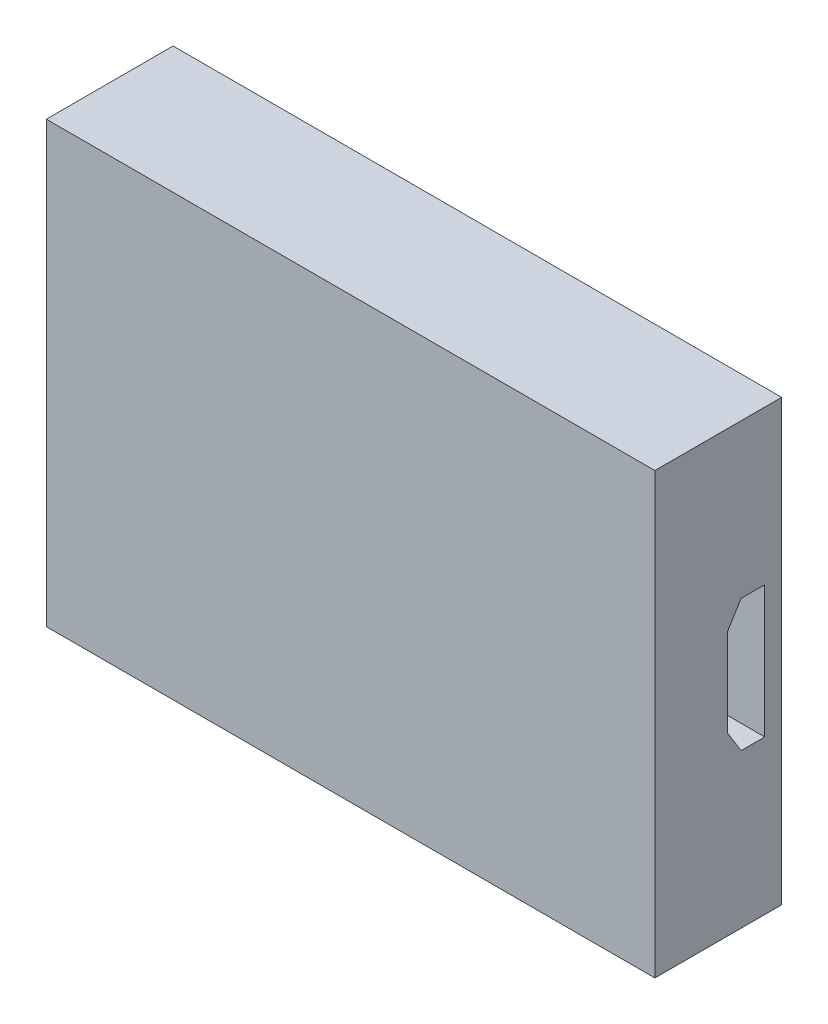
ISO-10303-21;
HEADER;
FILE_DESCRIPTION(('STEP AP214'),'2;1');
FILE_NAME('part.step','',(''),(''),'','','');
FILE_SCHEMA(('AUTOMOTIVE_DESIGN { 1 0 10303 214 1 1 1 1 }'));
ENDSEC;
DATA;
#1=APPLICATION_CONTEXT('core data for automotive mechanical design processes');
#2=APPLICATION_PROTOCOL_DEFINITION('international standard','automotive_design',2000,#1);
#3=PRODUCT_CONTEXT('',#1,'mechanical');
#4=PRODUCT('Part','Part','',(#3));
#5=PRODUCT_RELATED_PRODUCT_CATEGORY('part','',(#4));
#6=PRODUCT_DEFINITION_FORMATION('','',#4);
#7=PRODUCT_DEFINITION_CONTEXT('part definition',#1,'design');
#8=PRODUCT_DEFINITION('design','',#6,#7);
#9=PRODUCT_DEFINITION_SHAPE('','',#8);
#10=(LENGTH_UNIT() NAMED_UNIT(*) SI_UNIT(.MILLI.,.METRE.));
#11=(NAMED_UNIT(*) PLANE_ANGLE_UNIT() SI_UNIT($,.RADIAN.));
#12=(NAMED_UNIT(*) SI_UNIT($,.STERADIAN.) SOLID_ANGLE_UNIT());
#13=UNCERTAINTY_MEASURE_WITH_UNIT(LENGTH_MEASURE(1.E-05),#10,'distance_accuracy_value','');
#14=(GEOMETRIC_REPRESENTATION_CONTEXT(3) GLOBAL_UNCERTAINTY_ASSIGNED_CONTEXT((#13)) GLOBAL_UNIT_ASSIGNED_CONTEXT((#10,
#11,#12)) REPRESENTATION_CONTEXT('',''));
#15=CARTESIAN_POINT('',(0.,0.,0.));
#16=DIRECTION('',(0.,0.,1.));
#17=DIRECTION('',(1.,0.,0.));
#18=AXIS2_PLACEMENT_3D('',#15,#16,#17);
#19=CARTESIAN_POINT('',(0.,13.,-5.5));
#20=DIRECTION('',(0.,1.,0.));
#21=DIRECTION('',(-1.,0.,0.));
#22=AXIS2_PLACEMENT_3D('',#19,#20,#21);
#23=PLANE('',#22);
#24=DIRECTION('',(0.,0.,1.));
#25=VECTOR('',#24,1.);
#26=CARTESIAN_POINT('',(-19.25,13.,-5.5));
#27=LINE('',#26,#25);
#28=CARTESIAN_POINT('',(-19.25,13.,-5.5));
#29=VERTEX_POINT('',#28);
#30=CARTESIAN_POINT('',(-19.25,13.,2.));
#31=VERTEX_POINT('',#30);
#32=EDGE_CURVE('E62',#29,#31,#27,.T.);
#33=ORIENTED_EDGE('',*,*,#32,.T.);
#34=DIRECTION('',(-1.,0.,0.));
#35=VECTOR('',#34,1.);
#36=CARTESIAN_POINT('',(0.,13.,2.));
#37=LINE('',#36,#35);
#38=CARTESIAN_POINT('',(16.75,13.,2.));
#39=VERTEX_POINT('',#38);
#40=EDGE_CURVE('E172',#39,#31,#37,.T.);
#41=ORIENTED_EDGE('',*,*,#40,.F.);
#42=DIRECTION('',(0.,0.,1.));
#43=VECTOR('',#42,1.);
#44=CARTESIAN_POINT('',(16.75,13.,-5.5));
#45=LINE('',#44,#43);
#46=CARTESIAN_POINT('',(16.75,13.,-5.5));
#47=VERTEX_POINT('',#46);
#48=EDGE_CURVE('E12',#47,#39,#45,.T.);
#49=ORIENTED_EDGE('',*,*,#48,.F.);
#50=DIRECTION('',(-1.,0.,0.));
#51=VECTOR('',#50,1.);
#52=CARTESIAN_POINT('',(0.,13.,-5.5));
#53=LINE('',#52,#51);
#54=EDGE_CURVE('E259',#47,#29,#53,.T.);
#55=ORIENTED_EDGE('',*,*,#54,.T.);
#56=EDGE_LOOP('',(#33,#41,#49,#55));
#57=FACE_BOUND('',#56,.T.);
#58=ADVANCED_FACE('F59',(#57),#23,.T.);
#59=CARTESIAN_POINT('',(16.75,0.,-5.5));
#60=DIRECTION('',(-1.,0.,0.));
#61=DIRECTION('',(0.,-1.,0.));
#62=AXIS2_PLACEMENT_3D('',#59,#60,#61);
#63=PLANE('',#62);
#64=DIRECTION('',(0.,-0.851658316704544,0.524097425664335));
#65=VECTOR('',#64,1.);
#66=CARTESIAN_POINT('',(16.75,3.9,-3.1));
#67=LINE('',#66,#65);
#68=CARTESIAN_POINT('',(16.75,3.9,-3.1));
#69=VERTEX_POINT('',#68);
#70=CARTESIAN_POINT('',(16.75,2.6,-2.3));
#71=VERTEX_POINT('',#70);
#72=EDGE_CURVE('E208',#69,#71,#67,.T.);
#73=ORIENTED_EDGE('',*,*,#72,.F.);
#74=DIRECTION('',(0.,0.,1.));
#75=VECTOR('',#74,1.);
#76=CARTESIAN_POINT('',(16.75,3.9,-4.5));
#77=LINE('',#76,#75);
#78=CARTESIAN_POINT('',(16.75,3.9,-4.5));
#79=VERTEX_POINT('',#78);
#80=EDGE_CURVE('E75',#79,#69,#77,.T.);
#81=ORIENTED_EDGE('',*,*,#80,.F.);
#82=DIRECTION('',(0.,1.,0.));
#83=VECTOR('',#82,1.);
#84=CARTESIAN_POINT('',(16.75,-3.9,-4.5));
#85=LINE('',#84,#83);
#86=CARTESIAN_POINT('',(16.75,-3.9,-4.5));
#87=VERTEX_POINT('',#86);
#88=EDGE_CURVE('E195',#87,#79,#85,.T.);
#89=ORIENTED_EDGE('',*,*,#88,.F.);
#90=DIRECTION('',(0.,0.,-1.));
#91=VECTOR('',#90,1.);
#92=CARTESIAN_POINT('',(16.75,-3.9,-4.5));
#93=LINE('',#92,#91);
#94=CARTESIAN_POINT('',(16.75,-3.9,-3.1));
#95=VERTEX_POINT('',#94);
#96=EDGE_CURVE('E199',#95,#87,#93,.T.);
#97=ORIENTED_EDGE('',*,*,#96,.F.);
#98=DIRECTION('',(0.,-0.851658316704544,-0.524097425664335));
#99=VECTOR('',#98,1.);
#100=CARTESIAN_POINT('',(16.75,-3.9,-3.1));
#101=LINE('',#100,#99);
#102=CARTESIAN_POINT('',(16.75,-2.6,-2.3));
#103=VERTEX_POINT('',#102);
#104=EDGE_CURVE('E202',#103,#95,#101,.T.);
#105=ORIENTED_EDGE('',*,*,#104,.F.);
#106=DIRECTION('',(0.,-1.,0.));
#107=VECTOR('',#106,1.);
#108=CARTESIAN_POINT('',(16.75,-2.6,-2.3));
#109=LINE('',#108,#107);
#110=EDGE_CURVE('E205',#71,#103,#109,.T.);
#111=ORIENTED_EDGE('',*,*,#110,.F.);
#112=EDGE_LOOP('',(#73,#81,#89,#97,#105,#111));
#113=FACE_BOUND('',#112,.T.);
#114=ORIENTED_EDGE('',*,*,#48,.T.);
#115=DIRECTION('',(0.,-1.,0.));
#116=VECTOR('',#115,1.);
#117=CARTESIAN_POINT('',(16.75,0.,2.));
#118=LINE('',#117,#116);
#119=CARTESIAN_POINT('',(16.75,-13.,2.));
#120=VERTEX_POINT('',#119);
#121=EDGE_CURVE('E165',#39,#120,#118,.T.);
#122=ORIENTED_EDGE('',*,*,#121,.T.);
#123=DIRECTION('',(0.,0.,1.));
#124=VECTOR('',#123,1.);
#125=CARTESIAN_POINT('',(16.75,-13.,-5.5));
#126=LINE('',#125,#124);
#127=CARTESIAN_POINT('',(16.75,-13.,-5.5));
#128=VERTEX_POINT('',#127);
#129=EDGE_CURVE('E67',#128,#120,#126,.T.);
#130=ORIENTED_EDGE('',*,*,#129,.F.);
#131=DIRECTION('',(0.,-1.,0.));
#132=VECTOR('',#131,1.);
#133=CARTESIAN_POINT('',(16.75,0.,-5.5));
#134=LINE('',#133,#132);
#135=EDGE_CURVE('E167',#47,#128,#134,.T.);
#136=ORIENTED_EDGE('',*,*,#135,.F.);
#137=EDGE_LOOP('',(#114,#122,#130,#136));
#138=FACE_BOUND('',#137,.T.);
#139=ADVANCED_FACE('F162',(#113,#138),#63,.F.);
#140=CARTESIAN_POINT('',(0.,-13.,-5.5));
#141=DIRECTION('',(0.,1.,0.));
#142=DIRECTION('',(-1.,0.,0.));
#143=AXIS2_PLACEMENT_3D('',#140,#141,#142);
#144=PLANE('',#143);
#145=ORIENTED_EDGE('',*,*,#129,.T.);
#146=DIRECTION('',(-1.,0.,0.));
#147=VECTOR('',#146,1.);
#148=CARTESIAN_POINT('',(0.,-13.,2.));
#149=LINE('',#148,#147);
#150=CARTESIAN_POINT('',(-19.25,-13.,2.));
#151=VERTEX_POINT('',#150);
#152=EDGE_CURVE('E180',#120,#151,#149,.T.);
#153=ORIENTED_EDGE('',*,*,#152,.T.);
#154=DIRECTION('',(0.,0.,1.));
#155=VECTOR('',#154,1.);
#156=CARTESIAN_POINT('',(-19.25,-13.,-5.5));
#157=LINE('',#156,#155);
#158=CARTESIAN_POINT('',(-19.25,-13.,-5.5));
#159=VERTEX_POINT('',#158);
#160=EDGE_CURVE('E275',#159,#151,#157,.T.);
#161=ORIENTED_EDGE('',*,*,#160,.F.);
#162=DIRECTION('',(-1.,0.,0.));
#163=VECTOR('',#162,1.);
#164=CARTESIAN_POINT('',(0.,-13.,-5.5));
#165=LINE('',#164,#163);
#166=EDGE_CURVE('E272',#128,#159,#165,.T.);
#167=ORIENTED_EDGE('',*,*,#166,.F.);
#168=EDGE_LOOP('',(#145,#153,#161,#167));
#169=FACE_BOUND('',#168,.T.);
#170=ADVANCED_FACE('F282',(#169),#144,.F.);
#171=CARTESIAN_POINT('',(-19.25,0.,-5.5));
#172=DIRECTION('',(-1.,0.,0.));
#173=DIRECTION('',(0.,-1.,0.));
#174=AXIS2_PLACEMENT_3D('',#171,#172,#173);
#175=PLANE('',#174);
#176=CARTESIAN_POINT('',(-19.25,4.2,-2.5));
#177=DIRECTION('',(-1.,0.,0.));
#178=DIRECTION('',(0.,-1.,0.));
#179=AXIS2_PLACEMENT_3D('',#176,#177,#178);
#180=CIRCLE('',#179,0.5);
#181=CARTESIAN_POINT('',(-19.25,3.7,-2.5));
#182=VERTEX_POINT('',#181);
#183=EDGE_CURVE('E425',#182,#182,#180,.T.);
#184=ORIENTED_EDGE('',*,*,#183,.F.);
#185=EDGE_LOOP('',(#184));
#186=FACE_BOUND('',#185,.T.);
#187=CARTESIAN_POINT('',(-19.25,-4.2,-2.5));
#188=DIRECTION('',(-1.,0.,0.));
#189=DIRECTION('',(0.,1.,0.));
#190=AXIS2_PLACEMENT_3D('',#187,#188,#189);
#191=CIRCLE('',#190,0.5);
#192=CARTESIAN_POINT('',(-19.25,-3.7,-2.5));
#193=VERTEX_POINT('',#192);
#194=EDGE_CURVE('E433',#193,#193,#191,.T.);
#195=ORIENTED_EDGE('',*,*,#194,.F.);
#196=EDGE_LOOP('',(#195));
#197=FACE_BOUND('',#196,.T.);
#198=ORIENTED_EDGE('',*,*,#160,.T.);
#199=DIRECTION('',(0.,-1.,0.));
#200=VECTOR('',#199,1.);
#201=CARTESIAN_POINT('',(-19.25,0.,2.));
#202=LINE('',#201,#200);
#203=EDGE_CURVE('E176',#31,#151,#202,.T.);
#204=ORIENTED_EDGE('',*,*,#203,.F.);
#205=ORIENTED_EDGE('',*,*,#32,.F.);
#206=DIRECTION('',(0.,-1.,0.));
#207=VECTOR('',#206,1.);
#208=CARTESIAN_POINT('',(-19.25,0.,-5.5));
#209=LINE('',#208,#207);
#210=EDGE_CURVE('E269',#29,#159,#209,.T.);
#211=ORIENTED_EDGE('',*,*,#210,.T.);
#212=EDGE_LOOP('',(#198,#204,#205,#211));
#213=FACE_BOUND('',#212,.T.);
#214=ADVANCED_FACE('F278',(#186,#197,#213),#175,.T.);
#215=CARTESIAN_POINT('',(0.,0.,-5.5));
#216=DIRECTION('',(0.,0.,1.));
#217=DIRECTION('',(1.,0.,0.));
#218=AXIS2_PLACEMENT_3D('',#215,#216,#217);
#219=PLANE('',#218);
#220=CARTESIAN_POINT('',(14.7499999999998,-11.,-5.5));
#221=DIRECTION('',(0.,0.,-1.));
#222=DIRECTION('',(-1.,0.,0.));
#223=AXIS2_PLACEMENT_3D('',#220,#221,#222);
#224=CIRCLE('',#223,0.9);
#225=CARTESIAN_POINT('',(13.8499999999998,-11.,-5.5));
#226=VERTEX_POINT('',#225);
#227=EDGE_CURVE('E426',#226,#226,#224,.T.);
#228=ORIENTED_EDGE('',*,*,#227,.F.);
#229=EDGE_LOOP('',(#228));
#230=FACE_BOUND('',#229,.T.);
#231=CARTESIAN_POINT('',(-17.2500000000002,-11.,-5.5));
#232=DIRECTION('',(0.,0.,-1.));
#233=DIRECTION('',(-1.,0.,0.));
#234=AXIS2_PLACEMENT_3D('',#231,#232,#233);
#235=CIRCLE('',#234,0.9);
#236=CARTESIAN_POINT('',(-18.1500000000002,-11.,-5.5));
#237=VERTEX_POINT('',#236);
#238=EDGE_CURVE('E446',#237,#237,#235,.T.);
#239=ORIENTED_EDGE('',*,*,#238,.F.);
#240=EDGE_LOOP('',(#239));
#241=FACE_BOUND('',#240,.T.);
#242=CARTESIAN_POINT('',(-17.25,11.,-5.5));
#243=DIRECTION('',(0.,0.,-1.));
#244=DIRECTION('',(-1.,0.,0.));
#245=AXIS2_PLACEMENT_3D('',#242,#243,#244);
#246=CIRCLE('',#245,0.9);
#247=CARTESIAN_POINT('',(-18.15,11.,-5.5));
#248=VERTEX_POINT('',#247);
#249=EDGE_CURVE('E440',#248,#248,#246,.T.);
#250=ORIENTED_EDGE('',*,*,#249,.F.);
#251=EDGE_LOOP('',(#250));
#252=FACE_BOUND('',#251,.T.);
#253=CARTESIAN_POINT('',(14.75,11.,-5.5));
#254=DIRECTION('',(0.,0.,-1.));
#255=DIRECTION('',(-1.,0.,0.));
#256=AXIS2_PLACEMENT_3D('',#253,#254,#255);
#257=CIRCLE('',#256,0.9);
#258=CARTESIAN_POINT('',(13.85,11.,-5.5));
#259=VERTEX_POINT('',#258);
#260=EDGE_CURVE('E184',#259,#259,#257,.T.);
#261=ORIENTED_EDGE('',*,*,#260,.F.);
#262=EDGE_LOOP('',(#261));
#263=FACE_BOUND('',#262,.T.);
#264=DIRECTION('',(0.,-1.,0.));
#265=VECTOR('',#264,1.);
#266=CARTESIAN_POINT('',(13.75,0.,-5.5));
#267=LINE('',#266,#265);
#268=CARTESIAN_POINT('',(13.75,10.,-5.5));
#269=VERTEX_POINT('',#268);
#270=CARTESIAN_POINT('',(13.75,-10.,-5.5));
#271=VERTEX_POINT('',#270);
#272=EDGE_CURVE('E245',#269,#271,#267,.T.);
#273=ORIENTED_EDGE('',*,*,#272,.F.);
#274=DIRECTION('',(-1.,0.,0.));
#275=VECTOR('',#274,1.);
#276=CARTESIAN_POINT('',(0.,10.,-5.5));
#277=LINE('',#276,#275);
#278=CARTESIAN_POINT('',(-16.25,10.,-5.5));
#279=VERTEX_POINT('',#278);
#280=EDGE_CURVE('E235',#269,#279,#277,.T.);
#281=ORIENTED_EDGE('',*,*,#280,.T.);
#282=DIRECTION('',(0.,-1.,0.));
#283=VECTOR('',#282,1.);
#284=CARTESIAN_POINT('',(-16.25,0.,-5.5));
#285=LINE('',#284,#283);
#286=CARTESIAN_POINT('',(-16.25,-10.,-5.5));
#287=VERTEX_POINT('',#286);
#288=EDGE_CURVE('E238',#279,#287,#285,.T.);
#289=ORIENTED_EDGE('',*,*,#288,.T.);
#290=DIRECTION('',(-1.,0.,0.));
#291=VECTOR('',#290,1.);
#292=CARTESIAN_POINT('',(0.,-10.,-5.5));
#293=LINE('',#292,#291);
#294=EDGE_CURVE('E242',#271,#287,#293,.T.);
#295=ORIENTED_EDGE('',*,*,#294,.F.);
#296=EDGE_LOOP('',(#273,#281,#289,#295));
#297=FACE_BOUND('',#296,.T.);
#298=ORIENTED_EDGE('',*,*,#54,.F.);
#299=ORIENTED_EDGE('',*,*,#135,.T.);
#300=ORIENTED_EDGE('',*,*,#166,.T.);
#301=ORIENTED_EDGE('',*,*,#210,.F.);
#302=EDGE_LOOP('',(#298,#299,#300,#301));
#303=FACE_BOUND('',#302,.T.);
#304=ADVANCED_FACE('F284',(#230,#241,#252,#263,#297,#303),#219,.F.);
#305=CARTESIAN_POINT('',(0.,10.,-5.5));
#306=DIRECTION('',(0.,1.,0.));
#307=DIRECTION('',(-1.,0.,0.));
#308=AXIS2_PLACEMENT_3D('',#305,#306,#307);
#309=PLANE('',#308);
#310=DIRECTION('',(-1.,0.,0.));
#311=VECTOR('',#310,1.);
#312=CARTESIAN_POINT('',(0.,10.,0.));
#313=LINE('',#312,#311);
#314=CARTESIAN_POINT('',(13.75,10.,0.));
#315=VERTEX_POINT('',#314);
#316=CARTESIAN_POINT('',(-16.25,10.,0.));
#317=VERTEX_POINT('',#316);
#318=EDGE_CURVE('E198',#315,#317,#313,.T.);
#319=ORIENTED_EDGE('',*,*,#318,.T.);
#320=DIRECTION('',(0.,0.,1.));
#321=VECTOR('',#320,1.);
#322=CARTESIAN_POINT('',(-16.25,10.,-5.5));
#323=LINE('',#322,#321);
#324=EDGE_CURVE('E247',#279,#317,#323,.T.);
#325=ORIENTED_EDGE('',*,*,#324,.F.);
#326=ORIENTED_EDGE('',*,*,#280,.F.);
#327=DIRECTION('',(0.,0.,1.));
#328=VECTOR('',#327,1.);
#329=CARTESIAN_POINT('',(13.75,10.,-5.5));
#330=LINE('',#329,#328);
#331=EDGE_CURVE('E256',#269,#315,#330,.T.);
#332=ORIENTED_EDGE('',*,*,#331,.T.);
#333=EDGE_LOOP('',(#319,#325,#326,#332));
#334=FACE_BOUND('',#333,.T.);
#335=ADVANCED_FACE('F286',(#334),#309,.F.);
#336=CARTESIAN_POINT('',(13.75,0.,-5.5));
#337=DIRECTION('',(-1.,0.,0.));
#338=DIRECTION('',(0.,-1.,0.));
#339=AXIS2_PLACEMENT_3D('',#336,#337,#338);
#340=PLANE('',#339);
#341=DIRECTION('',(0.,0.,1.));
#342=VECTOR('',#341,1.);
#343=CARTESIAN_POINT('',(13.75,3.9,-4.5));
#344=LINE('',#343,#342);
#345=CARTESIAN_POINT('',(13.75,3.9,-4.5));
#346=VERTEX_POINT('',#345);
#347=CARTESIAN_POINT('',(13.75,3.9,-3.1));
#348=VERTEX_POINT('',#347);
#349=EDGE_CURVE('E190',#346,#348,#344,.T.);
#350=ORIENTED_EDGE('',*,*,#349,.T.);
#351=DIRECTION('',(0.,-0.851658316704544,0.524097425664335));
#352=VECTOR('',#351,1.);
#353=CARTESIAN_POINT('',(13.75,3.9,-3.1));
#354=LINE('',#353,#352);
#355=CARTESIAN_POINT('',(13.75,2.6,-2.3));
#356=VERTEX_POINT('',#355);
#357=EDGE_CURVE('E191',#348,#356,#354,.T.);
#358=ORIENTED_EDGE('',*,*,#357,.T.);
#359=DIRECTION('',(0.,-1.,0.));
#360=VECTOR('',#359,1.);
#361=CARTESIAN_POINT('',(13.75,-2.6,-2.3));
#362=LINE('',#361,#360);
#363=CARTESIAN_POINT('',(13.75,-2.6,-2.3));
#364=VERTEX_POINT('',#363);
#365=EDGE_CURVE('E226',#356,#364,#362,.T.);
#366=ORIENTED_EDGE('',*,*,#365,.T.);
#367=DIRECTION('',(0.,-0.851658316704544,-0.524097425664335));
#368=VECTOR('',#367,1.);
#369=CARTESIAN_POINT('',(13.75,-3.9,-3.1));
#370=LINE('',#369,#368);
#371=CARTESIAN_POINT('',(13.75,-3.9,-3.1));
#372=VERTEX_POINT('',#371);
#373=EDGE_CURVE('E222',#364,#372,#370,.T.);
#374=ORIENTED_EDGE('',*,*,#373,.T.);
#375=DIRECTION('',(0.,0.,-1.));
#376=VECTOR('',#375,1.);
#377=CARTESIAN_POINT('',(13.75,-3.9,-4.5));
#378=LINE('',#377,#376);
#379=CARTESIAN_POINT('',(13.75,-3.9,-4.5));
#380=VERTEX_POINT('',#379);
#381=EDGE_CURVE('E218',#372,#380,#378,.T.);
#382=ORIENTED_EDGE('',*,*,#381,.T.);
#383=DIRECTION('',(0.,1.,0.));
#384=VECTOR('',#383,1.);
#385=CARTESIAN_POINT('',(13.75,-3.9,-4.5));
#386=LINE('',#385,#384);
#387=EDGE_CURVE('E214',#380,#346,#386,.T.);
#388=ORIENTED_EDGE('',*,*,#387,.T.);
#389=EDGE_LOOP('',(#350,#358,#366,#374,#382,#388));
#390=FACE_BOUND('',#389,.T.);
#391=DIRECTION('',(0.,-1.,0.));
#392=VECTOR('',#391,1.);
#393=CARTESIAN_POINT('',(13.75,0.,0.));
#394=LINE('',#393,#392);
#395=CARTESIAN_POINT('',(13.75,-10.,0.));
#396=VERTEX_POINT('',#395);
#397=EDGE_CURVE('E239',#315,#396,#394,.T.);
#398=ORIENTED_EDGE('',*,*,#397,.F.);
#399=ORIENTED_EDGE('',*,*,#331,.F.);
#400=ORIENTED_EDGE('',*,*,#272,.T.);
#401=DIRECTION('',(0.,0.,1.));
#402=VECTOR('',#401,1.);
#403=CARTESIAN_POINT('',(13.75,-10.,-5.5));
#404=LINE('',#403,#402);
#405=EDGE_CURVE('E260',#271,#396,#404,.T.);
#406=ORIENTED_EDGE('',*,*,#405,.T.);
#407=EDGE_LOOP('',(#398,#399,#400,#406));
#408=FACE_BOUND('',#407,.T.);
#409=ADVANCED_FACE('F293',(#390,#408),#340,.T.);
#410=CARTESIAN_POINT('',(0.,-10.,-5.5));
#411=DIRECTION('',(0.,1.,0.));
#412=DIRECTION('',(-1.,0.,0.));
#413=AXIS2_PLACEMENT_3D('',#410,#411,#412);
#414=PLANE('',#413);
#415=DIRECTION('',(-1.,0.,0.));
#416=VECTOR('',#415,1.);
#417=CARTESIAN_POINT('',(0.,-10.,0.));
#418=LINE('',#417,#416);
#419=CARTESIAN_POINT('',(-16.25,-10.,0.));
#420=VERTEX_POINT('',#419);
#421=EDGE_CURVE('E253',#396,#420,#418,.T.);
#422=ORIENTED_EDGE('',*,*,#421,.F.);
#423=ORIENTED_EDGE('',*,*,#405,.F.);
#424=ORIENTED_EDGE('',*,*,#294,.T.);
#425=DIRECTION('',(0.,0.,1.));
#426=VECTOR('',#425,1.);
#427=CARTESIAN_POINT('',(-16.25,-10.,-5.5));
#428=LINE('',#427,#426);
#429=EDGE_CURVE('E263',#287,#420,#428,.T.);
#430=ORIENTED_EDGE('',*,*,#429,.T.);
#431=EDGE_LOOP('',(#422,#423,#424,#430));
#432=FACE_BOUND('',#431,.T.);
#433=ADVANCED_FACE('F350',(#432),#414,.T.);
#434=CARTESIAN_POINT('',(-16.25,0.,-5.5));
#435=DIRECTION('',(-1.,0.,0.));
#436=DIRECTION('',(0.,-1.,0.));
#437=AXIS2_PLACEMENT_3D('',#434,#435,#436);
#438=PLANE('',#437);
#439=CARTESIAN_POINT('',(-16.25,4.2,-2.5));
#440=DIRECTION('',(-1.,0.,0.));
#441=DIRECTION('',(0.,-1.,0.));
#442=AXIS2_PLACEMENT_3D('',#439,#440,#441);
#443=CIRCLE('',#442,0.5);
#444=CARTESIAN_POINT('',(-16.25,3.7,-2.5));
#445=VERTEX_POINT('',#444);
#446=EDGE_CURVE('E361',#445,#445,#443,.F.);
#447=ORIENTED_EDGE('',*,*,#446,.F.);
#448=EDGE_LOOP('',(#447));
#449=FACE_BOUND('',#448,.T.);
#450=CARTESIAN_POINT('',(-16.25,-4.2,-2.5));
#451=DIRECTION('',(-1.,0.,0.));
#452=DIRECTION('',(0.,-1.,0.));
#453=AXIS2_PLACEMENT_3D('',#450,#451,#452);
#454=CIRCLE('',#453,0.5);
#455=CARTESIAN_POINT('',(-16.25,-4.7,-2.5));
#456=VERTEX_POINT('',#455);
#457=EDGE_CURVE('E365',#456,#456,#454,.F.);
#458=ORIENTED_EDGE('',*,*,#457,.F.);
#459=EDGE_LOOP('',(#458));
#460=FACE_BOUND('',#459,.T.);
#461=DIRECTION('',(0.,-1.,0.));
#462=VECTOR('',#461,1.);
#463=CARTESIAN_POINT('',(-16.25,0.,0.));
#464=LINE('',#463,#462);
#465=EDGE_CURVE('E250',#317,#420,#464,.T.);
#466=ORIENTED_EDGE('',*,*,#465,.T.);
#467=ORIENTED_EDGE('',*,*,#429,.F.);
#468=ORIENTED_EDGE('',*,*,#288,.F.);
#469=ORIENTED_EDGE('',*,*,#324,.T.);
#470=EDGE_LOOP('',(#466,#467,#468,#469));
#471=FACE_BOUND('',#470,.T.);
#472=ADVANCED_FACE('F347',(#449,#460,#471),#438,.F.);
#473=CARTESIAN_POINT('',(-19.251,3.9,-4.5));
#474=DIRECTION('',(0.,1.,0.));
#475=DIRECTION('',(0.,0.,1.));
#476=AXIS2_PLACEMENT_3D('',#473,#474,#475);
#477=PLANE('',#476);
#478=DIRECTION('',(1.,0.,0.));
#479=VECTOR('',#478,1.);
#480=CARTESIAN_POINT('',(-19.251,3.9,-4.5));
#481=LINE('',#480,#479);
#482=EDGE_CURVE('E217',#346,#79,#481,.T.);
#483=ORIENTED_EDGE('',*,*,#482,.T.);
#484=ORIENTED_EDGE('',*,*,#80,.T.);
#485=DIRECTION('',(1.,0.,0.));
#486=VECTOR('',#485,1.);
#487=CARTESIAN_POINT('',(-19.251,3.9,-3.1));
#488=LINE('',#487,#486);
#489=EDGE_CURVE('E213',#348,#69,#488,.T.);
#490=ORIENTED_EDGE('',*,*,#489,.F.);
#491=ORIENTED_EDGE('',*,*,#349,.F.);
#492=EDGE_LOOP('',(#483,#484,#490,#491));
#493=FACE_BOUND('',#492,.T.);
#494=ADVANCED_FACE('F314',(#493),#477,.F.);
#495=CARTESIAN_POINT('',(-19.251,-3.9,-4.5));
#496=DIRECTION('',(0.,0.,-1.));
#497=DIRECTION('',(-1.,0.,0.));
#498=AXIS2_PLACEMENT_3D('',#495,#496,#497);
#499=PLANE('',#498);
#500=DIRECTION('',(1.,0.,0.));
#501=VECTOR('',#500,1.);
#502=CARTESIAN_POINT('',(-19.251,-3.9,-4.5));
#503=LINE('',#502,#501);
#504=EDGE_CURVE('E221',#380,#87,#503,.T.);
#505=ORIENTED_EDGE('',*,*,#504,.T.);
#506=ORIENTED_EDGE('',*,*,#88,.T.);
#507=ORIENTED_EDGE('',*,*,#482,.F.);
#508=ORIENTED_EDGE('',*,*,#387,.F.);
#509=EDGE_LOOP('',(#505,#506,#507,#508));
#510=FACE_BOUND('',#509,.T.);
#511=ADVANCED_FACE('F320',(#510),#499,.F.);
#512=CARTESIAN_POINT('',(-19.251,-3.9,-4.5));
#513=DIRECTION('',(0.,-1.,0.));
#514=DIRECTION('',(0.,0.,-1.));
#515=AXIS2_PLACEMENT_3D('',#512,#513,#514);
#516=PLANE('',#515);
#517=DIRECTION('',(1.,0.,0.));
#518=VECTOR('',#517,1.);
#519=CARTESIAN_POINT('',(-19.251,-3.9,-3.1));
#520=LINE('',#519,#518);
#521=EDGE_CURVE('E225',#372,#95,#520,.T.);
#522=ORIENTED_EDGE('',*,*,#521,.T.);
#523=ORIENTED_EDGE('',*,*,#96,.T.);
#524=ORIENTED_EDGE('',*,*,#504,.F.);
#525=ORIENTED_EDGE('',*,*,#381,.F.);
#526=EDGE_LOOP('',(#522,#523,#524,#525));
#527=FACE_BOUND('',#526,.T.);
#528=ADVANCED_FACE('F322',(#527),#516,.F.);
#529=CARTESIAN_POINT('',(-19.251,-3.9,-3.1));
#530=DIRECTION('',(0.,-0.524097425664335,0.851658316704544));
#531=DIRECTION('',(0.,-0.851658316704544,-0.524097425664335));
#532=AXIS2_PLACEMENT_3D('',#529,#530,#531);
#533=PLANE('',#532);
#534=DIRECTION('',(1.,0.,0.));
#535=VECTOR('',#534,1.);
#536=CARTESIAN_POINT('',(-19.251,-2.6,-2.3));
#537=LINE('',#536,#535);
#538=EDGE_CURVE('E194',#364,#103,#537,.T.);
#539=ORIENTED_EDGE('',*,*,#538,.T.);
#540=ORIENTED_EDGE('',*,*,#104,.T.);
#541=ORIENTED_EDGE('',*,*,#521,.F.);
#542=ORIENTED_EDGE('',*,*,#373,.F.);
#543=EDGE_LOOP('',(#539,#540,#541,#542));
#544=FACE_BOUND('',#543,.T.);
#545=ADVANCED_FACE('F326',(#544),#533,.F.);
#546=CARTESIAN_POINT('',(-19.251,-2.6,-2.3));
#547=DIRECTION('',(0.,0.,1.));
#548=DIRECTION('',(1.,0.,0.));
#549=AXIS2_PLACEMENT_3D('',#546,#547,#548);
#550=PLANE('',#549);
#551=DIRECTION('',(1.,0.,0.));
#552=VECTOR('',#551,1.);
#553=CARTESIAN_POINT('',(-19.251,2.6,-2.3));
#554=LINE('',#553,#552);
#555=EDGE_CURVE('E83',#356,#71,#554,.T.);
#556=ORIENTED_EDGE('',*,*,#555,.T.);
#557=ORIENTED_EDGE('',*,*,#110,.T.);
#558=ORIENTED_EDGE('',*,*,#538,.F.);
#559=ORIENTED_EDGE('',*,*,#365,.F.);
#560=EDGE_LOOP('',(#556,#557,#558,#559));
#561=FACE_BOUND('',#560,.T.);
#562=ADVANCED_FACE('F329',(#561),#550,.F.);
#563=CARTESIAN_POINT('',(-19.251,3.9,-3.1));
#564=DIRECTION('',(0.,0.524097425664335,0.851658316704544));
#565=DIRECTION('',(0.,-0.851658316704544,0.524097425664335));
#566=AXIS2_PLACEMENT_3D('',#563,#564,#565);
#567=PLANE('',#566);
#568=ORIENTED_EDGE('',*,*,#489,.T.);
#569=ORIENTED_EDGE('',*,*,#72,.T.);
#570=ORIENTED_EDGE('',*,*,#555,.F.);
#571=ORIENTED_EDGE('',*,*,#357,.F.);
#572=EDGE_LOOP('',(#568,#569,#570,#571));
#573=FACE_BOUND('',#572,.T.);
#574=ADVANCED_FACE('F313',(#573),#567,.F.);
#575=CARTESIAN_POINT('',(0.,0.,0.));
#576=DIRECTION('',(0.,0.,1.));
#577=DIRECTION('',(1.,0.,0.));
#578=AXIS2_PLACEMENT_3D('',#575,#576,#577);
#579=PLANE('',#578);
#580=ORIENTED_EDGE('',*,*,#318,.F.);
#581=ORIENTED_EDGE('',*,*,#397,.T.);
#582=ORIENTED_EDGE('',*,*,#421,.T.);
#583=ORIENTED_EDGE('',*,*,#465,.F.);
#584=EDGE_LOOP('',(#580,#581,#582,#583));
#585=FACE_BOUND('',#584,.T.);
#586=ADVANCED_FACE('F336',(#585),#579,.F.);
#587=CARTESIAN_POINT('',(0.,0.,2.));
#588=DIRECTION('',(0.,0.,1.));
#589=DIRECTION('',(1.,0.,0.));
#590=AXIS2_PLACEMENT_3D('',#587,#588,#589);
#591=PLANE('',#590);
#592=ORIENTED_EDGE('',*,*,#121,.F.);
#593=ORIENTED_EDGE('',*,*,#40,.T.);
#594=ORIENTED_EDGE('',*,*,#203,.T.);
#595=ORIENTED_EDGE('',*,*,#152,.F.);
#596=EDGE_LOOP('',(#592,#593,#594,#595));
#597=FACE_BOUND('',#596,.T.);
#598=ADVANCED_FACE('F178',(#597),#591,.T.);
#599=CARTESIAN_POINT('',(14.75,11.,-0.5));
#600=DIRECTION('',(0.,0.,-1.));
#601=DIRECTION('',(-1.,0.,0.));
#602=AXIS2_PLACEMENT_3D('',#599,#600,#601);
#603=CYLINDRICAL_SURFACE('',#602,0.9);
#604=CARTESIAN_POINT('',(14.75,11.,-0.5));
#605=DIRECTION('',(0.,0.,-1.));
#606=DIRECTION('',(-1.,0.,0.));
#607=AXIS2_PLACEMENT_3D('',#604,#605,#606);
#608=CIRCLE('',#607,0.9);
#609=CARTESIAN_POINT('',(13.85,11.,-0.5));
#610=VERTEX_POINT('',#609);
#611=EDGE_CURVE('E181',#610,#610,#608,.T.);
#612=ORIENTED_EDGE('',*,*,#611,.F.);
#613=EDGE_LOOP('',(#612));
#614=FACE_BOUND('',#613,.T.);
#615=ORIENTED_EDGE('',*,*,#260,.T.);
#616=EDGE_LOOP('',(#615));
#617=FACE_BOUND('',#616,.T.);
#618=ADVANCED_FACE('F379',(#614,#617),#603,.F.);
#619=CARTESIAN_POINT('',(14.75,11.,-0.5));
#620=DIRECTION('',(0.,0.,-1.));
#621=DIRECTION('',(-1.,0.,0.));
#622=AXIS2_PLACEMENT_3D('',#619,#620,#621);
#623=PLANE('',#622);
#624=ORIENTED_EDGE('',*,*,#611,.T.);
#625=EDGE_LOOP('',(#624));
#626=FACE_BOUND('',#625,.T.);
#627=ADVANCED_FACE('F384',(#626),#623,.T.);
#628=CARTESIAN_POINT('',(-17.25,11.,-0.5));
#629=DIRECTION('',(0.,0.,-1.));
#630=DIRECTION('',(-1.,0.,0.));
#631=AXIS2_PLACEMENT_3D('',#628,#629,#630);
#632=CYLINDRICAL_SURFACE('',#631,0.9);
#633=CARTESIAN_POINT('',(-17.25,11.,-0.5));
#634=DIRECTION('',(0.,0.,-1.));
#635=DIRECTION('',(-1.,0.,0.));
#636=AXIS2_PLACEMENT_3D('',#633,#634,#635);
#637=CIRCLE('',#636,0.9);
#638=CARTESIAN_POINT('',(-18.15,11.,-0.5));
#639=VERTEX_POINT('',#638);
#640=EDGE_CURVE('E437',#639,#639,#637,.T.);
#641=ORIENTED_EDGE('',*,*,#640,.F.);
#642=EDGE_LOOP('',(#641));
#643=FACE_BOUND('',#642,.T.);
#644=ORIENTED_EDGE('',*,*,#249,.T.);
#645=EDGE_LOOP('',(#644));
#646=FACE_BOUND('',#645,.T.);
#647=ADVANCED_FACE('F388',(#643,#646),#632,.F.);
#648=CARTESIAN_POINT('',(-17.25,11.,-0.5));
#649=DIRECTION('',(0.,0.,-1.));
#650=DIRECTION('',(-1.,0.,0.));
#651=AXIS2_PLACEMENT_3D('',#648,#649,#650);
#652=PLANE('',#651);
#653=ORIENTED_EDGE('',*,*,#640,.T.);
#654=EDGE_LOOP('',(#653));
#655=FACE_BOUND('',#654,.T.);
#656=ADVANCED_FACE('F403',(#655),#652,.T.);
#657=CARTESIAN_POINT('',(-17.2500000000002,-11.,-0.5));
#658=DIRECTION('',(0.,0.,-1.));
#659=DIRECTION('',(-1.,0.,0.));
#660=AXIS2_PLACEMENT_3D('',#657,#658,#659);
#661=CYLINDRICAL_SURFACE('',#660,0.9);
#662=CARTESIAN_POINT('',(-17.2500000000002,-11.,-0.5));
#663=DIRECTION('',(0.,0.,-1.));
#664=DIRECTION('',(-1.,0.,0.));
#665=AXIS2_PLACEMENT_3D('',#662,#663,#664);
#666=CIRCLE('',#665,0.9);
#667=CARTESIAN_POINT('',(-18.1500000000002,-11.,-0.5));
#668=VERTEX_POINT('',#667);
#669=EDGE_CURVE('E443',#668,#668,#666,.T.);
#670=ORIENTED_EDGE('',*,*,#669,.F.);
#671=EDGE_LOOP('',(#670));
#672=FACE_BOUND('',#671,.T.);
#673=ORIENTED_EDGE('',*,*,#238,.T.);
#674=EDGE_LOOP('',(#673));
#675=FACE_BOUND('',#674,.T.);
#676=ADVANCED_FACE('F400',(#672,#675),#661,.F.);
#677=CARTESIAN_POINT('',(-17.2500000000002,-11.,-0.5));
#678=DIRECTION('',(0.,0.,-1.));
#679=DIRECTION('',(-1.,0.,0.));
#680=AXIS2_PLACEMENT_3D('',#677,#678,#679);
#681=PLANE('',#680);
#682=ORIENTED_EDGE('',*,*,#669,.T.);
#683=EDGE_LOOP('',(#682));
#684=FACE_BOUND('',#683,.T.);
#685=ADVANCED_FACE('F394',(#684),#681,.T.);
#686=CARTESIAN_POINT('',(14.7499999999998,-11.,-0.5));
#687=DIRECTION('',(0.,0.,-1.));
#688=DIRECTION('',(-1.,0.,0.));
#689=AXIS2_PLACEMENT_3D('',#686,#687,#688);
#690=CYLINDRICAL_SURFACE('',#689,0.9);
#691=CARTESIAN_POINT('',(14.7499999999998,-11.,-0.5));
#692=DIRECTION('',(0.,0.,-1.));
#693=DIRECTION('',(-1.,0.,0.));
#694=AXIS2_PLACEMENT_3D('',#691,#692,#693);
#695=CIRCLE('',#694,0.9);
#696=CARTESIAN_POINT('',(13.8499999999998,-11.,-0.5));
#697=VERTEX_POINT('',#696);
#698=EDGE_CURVE('E429',#697,#697,#695,.T.);
#699=ORIENTED_EDGE('',*,*,#698,.F.);
#700=EDGE_LOOP('',(#699));
#701=FACE_BOUND('',#700,.T.);
#702=ORIENTED_EDGE('',*,*,#227,.T.);
#703=EDGE_LOOP('',(#702));
#704=FACE_BOUND('',#703,.T.);
#705=ADVANCED_FACE('F390',(#701,#704),#690,.F.);
#706=CARTESIAN_POINT('',(14.7499999999998,-11.,-0.5));
#707=DIRECTION('',(0.,0.,-1.));
#708=DIRECTION('',(-1.,0.,0.));
#709=AXIS2_PLACEMENT_3D('',#706,#707,#708);
#710=PLANE('',#709);
#711=ORIENTED_EDGE('',*,*,#698,.T.);
#712=EDGE_LOOP('',(#711));
#713=FACE_BOUND('',#712,.T.);
#714=ADVANCED_FACE('F393',(#713),#710,.T.);
#715=CARTESIAN_POINT('',(16.751,-4.2,-2.5));
#716=DIRECTION('',(-1.,0.,0.));
#717=DIRECTION('',(0.,-1.,0.));
#718=AXIS2_PLACEMENT_3D('',#715,#716,#717);
#719=CYLINDRICAL_SURFACE('',#718,0.5);
#720=ORIENTED_EDGE('',*,*,#194,.T.);
#721=EDGE_LOOP('',(#720));
#722=FACE_BOUND('',#721,.T.);
#723=ORIENTED_EDGE('',*,*,#457,.T.);
#724=EDGE_LOOP('',(#723));
#725=FACE_BOUND('',#724,.T.);
#726=ADVANCED_FACE('F398',(#722,#725),#719,.F.);
#727=CARTESIAN_POINT('',(16.751,4.2,-2.5));
#728=DIRECTION('',(-1.,0.,0.));
#729=DIRECTION('',(0.,-1.,0.));
#730=AXIS2_PLACEMENT_3D('',#727,#728,#729);
#731=CYLINDRICAL_SURFACE('',#730,0.5);
#732=ORIENTED_EDGE('',*,*,#183,.T.);
#733=EDGE_LOOP('',(#732));
#734=FACE_BOUND('',#733,.T.);
#735=ORIENTED_EDGE('',*,*,#446,.T.);
#736=EDGE_LOOP('',(#735));
#737=FACE_BOUND('',#736,.T.);
#738=ADVANCED_FACE('F416',(#734,#737),#731,.F.);
#739=CLOSED_SHELL('',(#58,#139,#170,#214,#304,#335,#409,#433,#472,#494,#511,#528,#545,#562,#574,
#586,#598,#618,#627,#647,#656,#676,#685,#705,#714,#726,#738));
#740=MANIFOLD_SOLID_BREP('B2',#739);
#741=ADVANCED_BREP_SHAPE_REPRESENTATION('',(#18,#740),#14);
#742=SHAPE_DEFINITION_REPRESENTATION(#9,#741);
ENDSEC;
END-ISO-10303-21;
